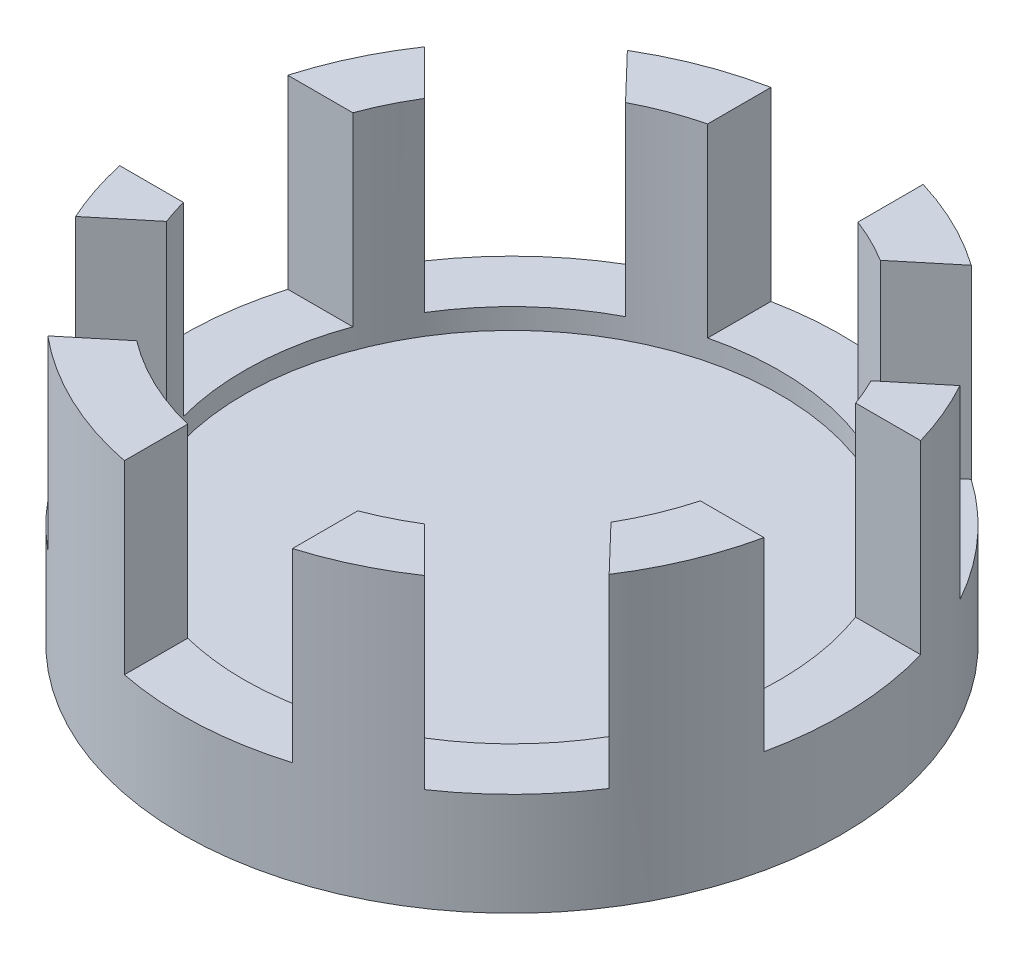
ISO-10303-21;
HEADER;
FILE_DESCRIPTION(('STEP AP214'),'2;1');
FILE_NAME('part.step','',(''),(''),'','','');
FILE_SCHEMA(('AUTOMOTIVE_DESIGN { 1 0 10303 214 1 1 1 1 }'));
ENDSEC;
DATA;
#1=APPLICATION_CONTEXT('core data for automotive mechanical design processes');
#2=APPLICATION_PROTOCOL_DEFINITION('international standard','automotive_design',2000,#1);
#3=PRODUCT_CONTEXT('',#1,'mechanical');
#4=PRODUCT('Part','Part','',(#3));
#5=PRODUCT_RELATED_PRODUCT_CATEGORY('part','',(#4));
#6=PRODUCT_DEFINITION_FORMATION('','',#4);
#7=PRODUCT_DEFINITION_CONTEXT('part definition',#1,'design');
#8=PRODUCT_DEFINITION('design','',#6,#7);
#9=PRODUCT_DEFINITION_SHAPE('','',#8);
#10=(LENGTH_UNIT() NAMED_UNIT(*) SI_UNIT(.MILLI.,.METRE.));
#11=(NAMED_UNIT(*) PLANE_ANGLE_UNIT() SI_UNIT($,.RADIAN.));
#12=(NAMED_UNIT(*) SI_UNIT($,.STERADIAN.) SOLID_ANGLE_UNIT());
#13=UNCERTAINTY_MEASURE_WITH_UNIT(LENGTH_MEASURE(1.E-05),#10,'distance_accuracy_value','');
#14=(GEOMETRIC_REPRESENTATION_CONTEXT(3) GLOBAL_UNCERTAINTY_ASSIGNED_CONTEXT((#13)) GLOBAL_UNIT_ASSIGNED_CONTEXT((#10,
#11,#12)) REPRESENTATION_CONTEXT('',''));
#15=CARTESIAN_POINT('',(0.,0.,0.));
#16=DIRECTION('',(0.,0.,1.));
#17=DIRECTION('',(1.,0.,0.));
#18=AXIS2_PLACEMENT_3D('',#15,#16,#17);
#19=CARTESIAN_POINT('',(0.,20.,0.));
#20=DIRECTION('',(0.,-1.,0.));
#21=DIRECTION('',(0.,0.,-1.));
#22=AXIS2_PLACEMENT_3D('',#19,#20,#21);
#23=CYLINDRICAL_SURFACE('',#22,16.);
#24=DIRECTION('',(0.,-1.,0.));
#25=VECTOR('',#24,1.);
#26=CARTESIAN_POINT('',(4.65163966751769,20.,-15.3088944213348));
#27=LINE('',#26,#25);
#28=CARTESIAN_POINT('',(4.65163966751769,5.,-15.3088944213348));
#29=VERTEX_POINT('',#28);
#30=CARTESIAN_POINT('',(4.65163966751769,14.,-15.3088944213348));
#31=VERTEX_POINT('',#30);
#32=EDGE_CURVE('E380',#29,#31,#27,.F.);
#33=ORIENTED_EDGE('',*,*,#32,.T.);
#34=CARTESIAN_POINT('',(0.,14.,0.));
#35=DIRECTION('',(0.,-1.,0.));
#36=DIRECTION('',(0.,0.,-1.));
#37=AXIS2_PLACEMENT_3D('',#34,#35,#36);
#38=CIRCLE('',#37,16.);
#39=CARTESIAN_POINT('',(9.21798652618479,14.,-13.0777950895048));
#40=VERTEX_POINT('',#39);
#41=EDGE_CURVE('E510',#31,#40,#38,.T.);
#42=ORIENTED_EDGE('',*,*,#41,.T.);
#43=DIRECTION('',(0.,1.,0.));
#44=VECTOR('',#43,1.);
#45=CARTESIAN_POINT('',(9.21798652618479,5.,-13.0777950895048));
#46=LINE('',#45,#44);
#47=CARTESIAN_POINT('',(9.21798652618479,5.,-13.0777950895048));
#48=VERTEX_POINT('',#47);
#49=EDGE_CURVE('E321',#48,#40,#46,.T.);
#50=ORIENTED_EDGE('',*,*,#49,.F.);
#51=CARTESIAN_POINT('',(0.,5.,0.));
#52=DIRECTION('',(0.,1.,0.));
#53=DIRECTION('',(0.,0.,1.));
#54=AXIS2_PLACEMENT_3D('',#51,#52,#53);
#55=CIRCLE('',#54,16.);
#56=CARTESIAN_POINT('',(14.0015684628841,5.,-7.74313118700506));
#57=VERTEX_POINT('',#56);
#58=EDGE_CURVE('E305',#57,#48,#55,.T.);
#59=ORIENTED_EDGE('',*,*,#58,.F.);
#60=DIRECTION('',(0.,1.,0.));
#61=VECTOR('',#60,1.);
#62=CARTESIAN_POINT('',(14.0015684628841,5.,-7.74313118700506));
#63=LINE('',#62,#61);
#64=CARTESIAN_POINT('',(14.0015684628841,14.,-7.74313118700506));
#65=VERTEX_POINT('',#64);
#66=EDGE_CURVE('E313',#57,#65,#63,.T.);
#67=ORIENTED_EDGE('',*,*,#66,.T.);
#68=CARTESIAN_POINT('',(15.3604587451895,14.,-4.47842685966077));
#69=VERTEX_POINT('',#68);
#70=EDGE_CURVE('E503',#65,#69,#38,.T.);
#71=ORIENTED_EDGE('',*,*,#70,.T.);
#72=DIRECTION('',(0.,-1.,0.));
#73=VECTOR('',#72,1.);
#74=CARTESIAN_POINT('',(15.3604587451895,20.,-4.47842685966077));
#75=LINE('',#74,#73);
#76=CARTESIAN_POINT('',(15.3604587451895,5.,-4.47842685966077));
#77=VERTEX_POINT('',#76);
#78=EDGE_CURVE('E404',#69,#77,#75,.T.);
#79=ORIENTED_EDGE('',*,*,#78,.T.);
#80=CARTESIAN_POINT('',(0.,5.,0.));
#81=DIRECTION('',(0.,-1.,0.));
#82=DIRECTION('',(0.,0.,-1.));
#83=AXIS2_PLACEMENT_3D('',#80,#81,#82);
#84=CIRCLE('',#83,16.);
#85=CARTESIAN_POINT('',(15.6341428460777,5.,3.40199610059112));
#86=VERTEX_POINT('',#85);
#87=EDGE_CURVE('E427',#77,#86,#84,.T.);
#88=ORIENTED_EDGE('',*,*,#87,.T.);
#89=DIRECTION('',(0.,-1.,0.));
#90=VECTOR('',#89,1.);
#91=CARTESIAN_POINT('',(15.6341428460777,20.,3.40199610059112));
#92=LINE('',#91,#90);
#93=CARTESIAN_POINT('',(15.6341428460777,14.,3.40199610059112));
#94=VERTEX_POINT('',#93);
#95=EDGE_CURVE('E283',#94,#86,#92,.T.);
#96=ORIENTED_EDGE('',*,*,#95,.F.);
#97=CARTESIAN_POINT('',(13.4239339734717,14.,8.70620449311135));
#98=VERTEX_POINT('',#97);
#99=EDGE_CURVE('E268',#94,#98,#38,.T.);
#100=ORIENTED_EDGE('',*,*,#99,.T.);
#101=DIRECTION('',(0.,-1.,0.));
#102=VECTOR('',#101,1.);
#103=CARTESIAN_POINT('',(13.4239339734717,20.,8.70620449311134));
#104=LINE('',#103,#102);
#105=CARTESIAN_POINT('',(13.4239339734717,5.,8.70620449311134));
#106=VERTEX_POINT('',#105);
#107=EDGE_CURVE('E281',#106,#98,#104,.F.);
#108=ORIENTED_EDGE('',*,*,#107,.F.);
#109=CARTESIAN_POINT('',(0.,5.,0.));
#110=DIRECTION('',(0.,1.,0.));
#111=DIRECTION('',(0.,0.,1.));
#112=AXIS2_PLACEMENT_3D('',#109,#110,#111);
#113=CIRCLE('',#112,16.);
#114=CARTESIAN_POINT('',(8.98940685394295,5.,13.2359572534171));
#115=VERTEX_POINT('',#114);
#116=EDGE_CURVE('E301',#115,#106,#113,.T.);
#117=ORIENTED_EDGE('',*,*,#116,.F.);
#118=DIRECTION('',(0.,-1.,0.));
#119=VECTOR('',#118,1.);
#120=CARTESIAN_POINT('',(8.98940685394295,20.,13.2359572534171));
#121=LINE('',#120,#119);
#122=CARTESIAN_POINT('',(8.98940685394295,14.,13.2359572534171));
#123=VERTEX_POINT('',#122);
#124=EDGE_CURVE('E294',#115,#123,#121,.F.);
#125=ORIENTED_EDGE('',*,*,#124,.T.);
#126=CARTESIAN_POINT('',(4.65163966751769,14.,15.3088944213348));
#127=VERTEX_POINT('',#126);
#128=EDGE_CURVE('E286',#123,#127,#38,.T.);
#129=ORIENTED_EDGE('',*,*,#128,.T.);
#130=DIRECTION('',(0.,-1.,0.));
#131=VECTOR('',#130,1.);
#132=CARTESIAN_POINT('',(4.65163966751769,20.,15.3088944213348));
#133=LINE('',#132,#131);
#134=CARTESIAN_POINT('',(4.65163966751769,5.,15.3088944213348));
#135=VERTEX_POINT('',#134);
#136=EDGE_CURVE('E382',#127,#135,#133,.T.);
#137=ORIENTED_EDGE('',*,*,#136,.T.);
#138=CARTESIAN_POINT('',(0.,5.,0.));
#139=DIRECTION('',(0.,-1.,0.));
#140=DIRECTION('',(0.,0.,-1.));
#141=AXIS2_PLACEMENT_3D('',#138,#139,#140);
#142=CIRCLE('',#141,16.);
#143=CARTESIAN_POINT('',(-3.12181870547557,5.,15.6924901774748));
#144=VERTEX_POINT('',#143);
#145=EDGE_CURVE('E387',#135,#144,#142,.T.);
#146=ORIENTED_EDGE('',*,*,#145,.T.);
#147=DIRECTION('',(0.,-1.,0.));
#148=VECTOR('',#147,1.);
#149=CARTESIAN_POINT('',(-3.12181870547557,20.,15.6924901774748));
#150=LINE('',#149,#148);
#151=CARTESIAN_POINT('',(-3.12181870547557,14.,15.6924901774748));
#152=VERTEX_POINT('',#151);
#153=EDGE_CURVE('E370',#144,#152,#150,.F.);
#154=ORIENTED_EDGE('',*,*,#153,.T.);
#155=CARTESIAN_POINT('',(-10.2261948236587,14.,12.3054841200408));
#156=VERTEX_POINT('',#155);
#157=EDGE_CURVE('E482',#152,#156,#38,.T.);
#158=ORIENTED_EDGE('',*,*,#157,.T.);
#159=DIRECTION('',(0.,-1.,0.));
#160=VECTOR('',#159,1.);
#161=CARTESIAN_POINT('',(-10.2261948236587,20.,12.3054841200408));
#162=LINE('',#161,#160);
#163=CARTESIAN_POINT('',(-10.2261948236587,5.,12.3054841200408));
#164=VERTEX_POINT('',#163);
#165=EDGE_CURVE('E352',#164,#156,#162,.F.);
#166=ORIENTED_EDGE('',*,*,#165,.F.);
#167=CARTESIAN_POINT('',(0.,5.,0.));
#168=DIRECTION('',(0.,1.,0.));
#169=DIRECTION('',(0.,0.,1.));
#170=AXIS2_PLACEMENT_3D('',#167,#168,#169);
#171=CIRCLE('',#170,16.);
#172=CARTESIAN_POINT('',(-14.5715954429554,5.,6.60822262388625));
#173=VERTEX_POINT('',#172);
#174=EDGE_CURVE('E350',#173,#164,#171,.T.);
#175=ORIENTED_EDGE('',*,*,#174,.F.);
#176=DIRECTION('',(0.,-1.,0.));
#177=VECTOR('',#176,1.);
#178=CARTESIAN_POINT('',(-14.5715954429554,20.,6.60822262388625));
#179=LINE('',#178,#177);
#180=CARTESIAN_POINT('',(-14.5715954429554,14.,6.60822262388625));
#181=VERTEX_POINT('',#180);
#182=EDGE_CURVE('E355',#181,#173,#179,.T.);
#183=ORIENTED_EDGE('',*,*,#182,.F.);
#184=CARTESIAN_POINT('',(-15.6341428460777,14.,3.40199610059112));
#185=VERTEX_POINT('',#184);
#186=EDGE_CURVE('E74',#181,#185,#38,.T.);
#187=ORIENTED_EDGE('',*,*,#186,.T.);
#188=DIRECTION('',(0.,-1.,0.));
#189=VECTOR('',#188,1.);
#190=CARTESIAN_POINT('',(-15.6341428460777,20.,3.40199610059112));
#191=LINE('',#190,#189);
#192=CARTESIAN_POINT('',(-15.6341428460777,5.,3.40199610059112));
#193=VERTEX_POINT('',#192);
#194=EDGE_CURVE('E420',#193,#185,#191,.F.);
#195=ORIENTED_EDGE('',*,*,#194,.F.);
#196=CARTESIAN_POINT('',(-15.3604587451895,5.,-4.47842685966077));
#197=VERTEX_POINT('',#196);
#198=EDGE_CURVE('E424',#193,#197,#84,.T.);
#199=ORIENTED_EDGE('',*,*,#198,.T.);
#200=DIRECTION('',(0.,-1.,0.));
#201=VECTOR('',#200,1.);
#202=CARTESIAN_POINT('',(-15.3604587451895,20.,-4.47842685966077));
#203=LINE('',#202,#201);
#204=CARTESIAN_POINT('',(-15.3604587451895,14.,-4.47842685966077));
#205=VERTEX_POINT('',#204);
#206=EDGE_CURVE('E398',#197,#205,#203,.F.);
#207=ORIENTED_EDGE('',*,*,#206,.T.);
#208=CARTESIAN_POINT('',(-13.2359572534171,14.,-8.98940685394295));
#209=VERTEX_POINT('',#208);
#210=EDGE_CURVE('E495',#205,#209,#38,.T.);
#211=ORIENTED_EDGE('',*,*,#210,.T.);
#212=DIRECTION('',(0.,-1.,0.));
#213=VECTOR('',#212,1.);
#214=CARTESIAN_POINT('',(-13.2359572534171,20.,-8.98940685394295));
#215=LINE('',#214,#213);
#216=CARTESIAN_POINT('',(-13.2359572534171,5.,-8.98940685394295));
#217=VERTEX_POINT('',#216);
#218=EDGE_CURVE('E334',#209,#217,#215,.T.);
#219=ORIENTED_EDGE('',*,*,#218,.T.);
#220=CARTESIAN_POINT('',(0.,5.,0.));
#221=DIRECTION('',(0.,1.,0.));
#222=DIRECTION('',(0.,0.,1.));
#223=AXIS2_PLACEMENT_3D('',#220,#221,#222);
#224=CIRCLE('',#223,16.);
#225=CARTESIAN_POINT('',(-8.1611205847714,5.,-13.7621259549831));
#226=VERTEX_POINT('',#225);
#227=EDGE_CURVE('E341',#226,#217,#224,.T.);
#228=ORIENTED_EDGE('',*,*,#227,.F.);
#229=DIRECTION('',(0.,-1.,0.));
#230=VECTOR('',#229,1.);
#231=CARTESIAN_POINT('',(-8.1611205847714,20.,-13.7621259549831));
#232=LINE('',#231,#230);
#233=CARTESIAN_POINT('',(-8.1611205847714,14.,-13.7621259549831));
#234=VERTEX_POINT('',#233);
#235=EDGE_CURVE('E339',#234,#226,#232,.T.);
#236=ORIENTED_EDGE('',*,*,#235,.F.);
#237=CARTESIAN_POINT('',(-3.12181870547557,14.,-15.6924901774748));
#238=VERTEX_POINT('',#237);
#239=EDGE_CURVE('E488',#234,#238,#38,.T.);
#240=ORIENTED_EDGE('',*,*,#239,.T.);
#241=DIRECTION('',(0.,-1.,0.));
#242=VECTOR('',#241,1.);
#243=CARTESIAN_POINT('',(-3.12181870547557,20.,-15.6924901774748));
#244=LINE('',#243,#242);
#245=CARTESIAN_POINT('',(-3.12181870547557,5.,-15.6924901774748));
#246=VERTEX_POINT('',#245);
#247=EDGE_CURVE('E373',#238,#246,#244,.T.);
#248=ORIENTED_EDGE('',*,*,#247,.T.);
#249=EDGE_CURVE('E384',#246,#29,#142,.T.);
#250=ORIENTED_EDGE('',*,*,#249,.T.);
#251=EDGE_LOOP('',(#33,#42,#50,#59,#67,#71,#79,#88,#96,#100,#108,#117,#125,#129,#137,#146,#154,
#158,#166,#175,#183,#187,#195,#199,#207,#211,#219,#228,#236,#240,#248,#250));
#252=FACE_BOUND('',#251,.T.);
#253=CARTESIAN_POINT('',(0.,0.,0.));
#254=DIRECTION('',(0.,1.,0.));
#255=DIRECTION('',(0.,0.,1.));
#256=AXIS2_PLACEMENT_3D('',#253,#254,#255);
#257=CIRCLE('',#256,16.);
#258=CARTESIAN_POINT('',(0.,0.,16.));
#259=VERTEX_POINT('',#258);
#260=EDGE_CURVE('E431',#259,#259,#257,.T.);
#261=ORIENTED_EDGE('',*,*,#260,.T.);
#262=EDGE_LOOP('',(#261));
#263=FACE_BOUND('',#262,.T.);
#264=ADVANCED_FACE('F60',(#252,#263),#23,.T.);
#265=CARTESIAN_POINT('',(0.,4.,0.));
#266=DIRECTION('',(0.,1.,0.));
#267=DIRECTION('',(0.,0.,1.));
#268=AXIS2_PLACEMENT_3D('',#265,#266,#267);
#269=CYLINDRICAL_SURFACE('',#268,13.);
#270=CARTESIAN_POINT('',(0.,4.,0.));
#271=DIRECTION('',(0.,1.,0.));
#272=DIRECTION('',(0.,0.,1.));
#273=AXIS2_PLACEMENT_3D('',#270,#271,#272);
#274=CIRCLE('',#273,13.);
#275=CARTESIAN_POINT('',(0.,4.,13.));
#276=VERTEX_POINT('',#275);
#277=EDGE_CURVE('E428',#276,#276,#274,.T.);
#278=ORIENTED_EDGE('',*,*,#277,.F.);
#279=EDGE_LOOP('',(#278));
#280=FACE_BOUND('',#279,.T.);
#281=DIRECTION('',(0.,1.,0.));
#282=VECTOR('',#281,1.);
#283=CARTESIAN_POINT('',(-3.12181870547557,4.,-12.6195977737067));
#284=LINE('',#283,#282);
#285=CARTESIAN_POINT('',(-3.12181870547557,5.,-12.6195977737067));
#286=VERTEX_POINT('',#285);
#287=CARTESIAN_POINT('',(-3.12181870547557,14.,-12.6195977737067));
#288=VERTEX_POINT('',#287);
#289=EDGE_CURVE('E365',#286,#288,#284,.T.);
#290=ORIENTED_EDGE('',*,*,#289,.T.);
#291=CARTESIAN_POINT('',(0.,14.,0.));
#292=DIRECTION('',(0.,-1.,0.));
#293=DIRECTION('',(0.,0.,-1.));
#294=AXIS2_PLACEMENT_3D('',#291,#292,#293);
#295=CIRCLE('',#294,13.);
#296=CARTESIAN_POINT('',(-6.01279974744786,14.,-11.5258942905569));
#297=VERTEX_POINT('',#296);
#298=EDGE_CURVE('E491',#288,#297,#295,.F.);
#299=ORIENTED_EDGE('',*,*,#298,.T.);
#300=DIRECTION('',(0.,1.,0.));
#301=VECTOR('',#300,1.);
#302=CARTESIAN_POINT('',(-6.01279974744786,4.,-11.5258942905569));
#303=LINE('',#302,#301);
#304=CARTESIAN_POINT('',(-6.01279974744786,5.,-11.5258942905569));
#305=VERTEX_POINT('',#304);
#306=EDGE_CURVE('E336',#305,#297,#303,.T.);
#307=ORIENTED_EDGE('',*,*,#306,.F.);
#308=CARTESIAN_POINT('',(0.,5.,0.));
#309=DIRECTION('',(0.,1.,0.));
#310=DIRECTION('',(0.,0.,1.));
#311=AXIS2_PLACEMENT_3D('',#308,#309,#310);
#312=CIRCLE('',#311,13.);
#313=CARTESIAN_POINT('',(-11.0670832492304,5.,-6.82053284975627));
#314=VERTEX_POINT('',#313);
#315=EDGE_CURVE('E459',#314,#305,#312,.F.);
#316=ORIENTED_EDGE('',*,*,#315,.F.);
#317=DIRECTION('',(0.,1.,0.));
#318=VECTOR('',#317,1.);
#319=CARTESIAN_POINT('',(-11.0670832492304,4.,-6.82053284975627));
#320=LINE('',#319,#318);
#321=CARTESIAN_POINT('',(-11.0670832492304,14.,-6.82053284975627));
#322=VERTEX_POINT('',#321);
#323=EDGE_CURVE('E329',#314,#322,#320,.T.);
#324=ORIENTED_EDGE('',*,*,#323,.T.);
#325=CARTESIAN_POINT('',(-12.2042489675797,14.,-4.47842685966077));
#326=VERTEX_POINT('',#325);
#327=EDGE_CURVE('E499',#322,#326,#295,.F.);
#328=ORIENTED_EDGE('',*,*,#327,.T.);
#329=DIRECTION('',(0.,1.,0.));
#330=VECTOR('',#329,1.);
#331=CARTESIAN_POINT('',(-12.2042489675797,4.,-4.47842685966077));
#332=LINE('',#331,#330);
#333=CARTESIAN_POINT('',(-12.2042489675797,5.,-4.47842685966077));
#334=VERTEX_POINT('',#333);
#335=EDGE_CURVE('E444',#326,#334,#332,.F.);
#336=ORIENTED_EDGE('',*,*,#335,.T.);
#337=CARTESIAN_POINT('',(0.,5.,0.));
#338=DIRECTION('',(0.,-1.,0.));
#339=DIRECTION('',(0.,0.,-1.));
#340=AXIS2_PLACEMENT_3D('',#337,#338,#339);
#341=CIRCLE('',#340,13.);
#342=CARTESIAN_POINT('',(-12.5469686590651,5.,3.40199610059112));
#343=VERTEX_POINT('',#342);
#344=EDGE_CURVE('E441',#334,#343,#341,.F.);
#345=ORIENTED_EDGE('',*,*,#344,.T.);
#346=DIRECTION('',(0.,1.,0.));
#347=VECTOR('',#346,1.);
#348=CARTESIAN_POINT('',(-12.5469686590651,4.,3.40199610059112));
#349=LINE('',#348,#347);
#350=CARTESIAN_POINT('',(-12.5469686590651,14.,3.40199610059112));
#351=VERTEX_POINT('',#350);
#352=EDGE_CURVE('E446',#351,#343,#349,.F.);
#353=ORIENTED_EDGE('',*,*,#352,.F.);
#354=CARTESIAN_POINT('',(-12.1555612647663,14.,4.6089402619815));
#355=VERTEX_POINT('',#354);
#356=EDGE_CURVE('E478',#351,#355,#295,.F.);
#357=ORIENTED_EDGE('',*,*,#356,.T.);
#358=DIRECTION('',(0.,1.,0.));
#359=VECTOR('',#358,1.);
#360=CARTESIAN_POINT('',(-12.1555612647663,4.,4.6089402619815));
#361=LINE('',#360,#359);
#362=CARTESIAN_POINT('',(-12.1555612647663,5.,4.6089402619815));
#363=VERTEX_POINT('',#362);
#364=EDGE_CURVE('E456',#363,#355,#361,.T.);
#365=ORIENTED_EDGE('',*,*,#364,.F.);
#366=CARTESIAN_POINT('',(0.,5.,0.));
#367=DIRECTION('',(0.,1.,0.));
#368=DIRECTION('',(0.,0.,1.));
#369=AXIS2_PLACEMENT_3D('',#366,#367,#368);
#370=CIRCLE('',#369,13.);
#371=CARTESIAN_POINT('',(-7.86459017066455,5.,10.3512425074233));
#372=VERTEX_POINT('',#371);
#373=EDGE_CURVE('E452',#372,#363,#370,.F.);
#374=ORIENTED_EDGE('',*,*,#373,.F.);
#375=DIRECTION('',(0.,1.,0.));
#376=VECTOR('',#375,1.);
#377=CARTESIAN_POINT('',(-7.86459017066455,4.,10.3512425074233));
#378=LINE('',#377,#376);
#379=CARTESIAN_POINT('',(-7.86459017066455,14.,10.3512425074233));
#380=VERTEX_POINT('',#379);
#381=EDGE_CURVE('E454',#380,#372,#378,.F.);
#382=ORIENTED_EDGE('',*,*,#381,.F.);
#383=CARTESIAN_POINT('',(-3.12181870547557,14.,12.6195977737067));
#384=VERTEX_POINT('',#383);
#385=EDGE_CURVE('E82',#380,#384,#295,.F.);
#386=ORIENTED_EDGE('',*,*,#385,.T.);
#387=DIRECTION('',(0.,1.,0.));
#388=VECTOR('',#387,1.);
#389=CARTESIAN_POINT('',(-3.12181870547557,4.,12.6195977737067));
#390=LINE('',#389,#388);
#391=CARTESIAN_POINT('',(-3.12181870547557,5.,12.6195977737067));
#392=VERTEX_POINT('',#391);
#393=EDGE_CURVE('E368',#384,#392,#390,.F.);
#394=ORIENTED_EDGE('',*,*,#393,.T.);
#395=CARTESIAN_POINT('',(0.,5.,0.));
#396=DIRECTION('',(0.,-1.,0.));
#397=DIRECTION('',(0.,0.,-1.));
#398=AXIS2_PLACEMENT_3D('',#395,#396,#397);
#399=CIRCLE('',#398,13.);
#400=CARTESIAN_POINT('',(4.65163966751769,5.,12.1392853333125));
#401=VERTEX_POINT('',#400);
#402=EDGE_CURVE('E451',#392,#401,#399,.F.);
#403=ORIENTED_EDGE('',*,*,#402,.T.);
#404=DIRECTION('',(0.,1.,0.));
#405=VECTOR('',#404,1.);
#406=CARTESIAN_POINT('',(4.65163966751769,4.,12.1392853333125));
#407=LINE('',#406,#405);
#408=CARTESIAN_POINT('',(4.65163966751769,14.,12.1392853333125));
#409=VERTEX_POINT('',#408);
#410=EDGE_CURVE('E375',#401,#409,#407,.T.);
#411=ORIENTED_EDGE('',*,*,#410,.T.);
#412=CARTESIAN_POINT('',(6.82053284975627,14.,11.0670832492304));
#413=VERTEX_POINT('',#412);
#414=EDGE_CURVE('E519',#409,#413,#295,.F.);
#415=ORIENTED_EDGE('',*,*,#414,.T.);
#416=DIRECTION('',(0.,1.,0.));
#417=VECTOR('',#416,1.);
#418=CARTESIAN_POINT('',(6.82053284975627,4.,11.0670832492304));
#419=LINE('',#418,#417);
#420=CARTESIAN_POINT('',(6.82053284975627,5.,11.0670832492304));
#421=VERTEX_POINT('',#420);
#422=EDGE_CURVE('E291',#413,#421,#419,.F.);
#423=ORIENTED_EDGE('',*,*,#422,.T.);
#424=CARTESIAN_POINT('',(0.,5.,0.));
#425=DIRECTION('',(0.,1.,0.));
#426=DIRECTION('',(0.,0.,1.));
#427=AXIS2_PLACEMENT_3D('',#424,#425,#426);
#428=CIRCLE('',#427,13.);
#429=CARTESIAN_POINT('',(11.2756131361482,5.,6.46997282868505));
#430=VERTEX_POINT('',#429);
#431=EDGE_CURVE('E67',#430,#421,#428,.F.);
#432=ORIENTED_EDGE('',*,*,#431,.F.);
#433=DIRECTION('',(0.,1.,0.));
#434=VECTOR('',#433,1.);
#435=CARTESIAN_POINT('',(11.2756131361482,4.,6.46997282868505));
#436=LINE('',#435,#434);
#437=CARTESIAN_POINT('',(11.2756131361482,14.,6.46997282868505));
#438=VERTEX_POINT('',#437);
#439=EDGE_CURVE('E292',#438,#430,#436,.F.);
#440=ORIENTED_EDGE('',*,*,#439,.F.);
#441=CARTESIAN_POINT('',(12.5469686590651,14.,3.40199610059112));
#442=VERTEX_POINT('',#441);
#443=EDGE_CURVE('E271',#438,#442,#295,.F.);
#444=ORIENTED_EDGE('',*,*,#443,.T.);
#445=DIRECTION('',(0.,1.,0.));
#446=VECTOR('',#445,1.);
#447=CARTESIAN_POINT('',(12.5469686590651,4.,3.40199610059112));
#448=LINE('',#447,#446);
#449=CARTESIAN_POINT('',(12.5469686590651,5.,3.40199610059112));
#450=VERTEX_POINT('',#449);
#451=EDGE_CURVE('E440',#450,#442,#448,.T.);
#452=ORIENTED_EDGE('',*,*,#451,.F.);
#453=CARTESIAN_POINT('',(12.2042489675796,5.,-4.47842685966077));
#454=VERTEX_POINT('',#453);
#455=EDGE_CURVE('E437',#450,#454,#341,.F.);
#456=ORIENTED_EDGE('',*,*,#455,.T.);
#457=DIRECTION('',(0.,1.,0.));
#458=VECTOR('',#457,1.);
#459=CARTESIAN_POINT('',(12.2042489675797,4.,-4.47842685966077));
#460=LINE('',#459,#458);
#461=CARTESIAN_POINT('',(12.2042489675797,14.,-4.47842685966077));
#462=VERTEX_POINT('',#461);
#463=EDGE_CURVE('E434',#454,#462,#460,.T.);
#464=ORIENTED_EDGE('',*,*,#463,.T.);
#465=CARTESIAN_POINT('',(11.6399638098899,14.,-5.78888957438754));
#466=VERTEX_POINT('',#465);
#467=EDGE_CURVE('E506',#462,#466,#295,.F.);
#468=ORIENTED_EDGE('',*,*,#467,.T.);
#469=DIRECTION('',(0.,1.,0.));
#470=VECTOR('',#469,1.);
#471=CARTESIAN_POINT('',(11.6399638098899,5.,-5.78888957438754));
#472=LINE('',#471,#470);
#473=CARTESIAN_POINT('',(11.6399638098899,5.,-5.78888957438754));
#474=VERTEX_POINT('',#473);
#475=EDGE_CURVE('E314',#474,#466,#472,.T.);
#476=ORIENTED_EDGE('',*,*,#475,.F.);
#477=CARTESIAN_POINT('',(0.,5.,0.));
#478=DIRECTION('',(0.,1.,0.));
#479=DIRECTION('',(0.,0.,1.));
#480=AXIS2_PLACEMENT_3D('',#477,#478,#479);
#481=CIRCLE('',#480,13.);
#482=CARTESIAN_POINT('',(6.80195234799567,5.,-11.0785127276));
#483=VERTEX_POINT('',#482);
#484=EDGE_CURVE('E310',#483,#474,#481,.F.);
#485=ORIENTED_EDGE('',*,*,#484,.F.);
#486=DIRECTION('',(0.,1.,0.));
#487=VECTOR('',#486,1.);
#488=CARTESIAN_POINT('',(6.80195234799567,5.,-11.0785127276));
#489=LINE('',#488,#487);
#490=CARTESIAN_POINT('',(6.80195234799567,14.,-11.0785127276));
#491=VERTEX_POINT('',#490);
#492=EDGE_CURVE('E318',#483,#491,#489,.T.);
#493=ORIENTED_EDGE('',*,*,#492,.T.);
#494=CARTESIAN_POINT('',(4.65163966751769,14.,-12.1392853333125));
#495=VERTEX_POINT('',#494);
#496=EDGE_CURVE('E513',#491,#495,#295,.F.);
#497=ORIENTED_EDGE('',*,*,#496,.T.);
#498=DIRECTION('',(0.,1.,0.));
#499=VECTOR('',#498,1.);
#500=CARTESIAN_POINT('',(4.65163966751769,4.,-12.1392853333125));
#501=LINE('',#500,#499);
#502=CARTESIAN_POINT('',(4.65163966751769,5.,-12.1392853333125));
#503=VERTEX_POINT('',#502);
#504=EDGE_CURVE('E378',#495,#503,#501,.F.);
#505=ORIENTED_EDGE('',*,*,#504,.T.);
#506=EDGE_CURVE('E448',#503,#286,#399,.F.);
#507=ORIENTED_EDGE('',*,*,#506,.T.);
#508=EDGE_LOOP('',(#290,#299,#307,#316,#324,#328,#336,#345,#353,#357,#365,#374,#382,#386,#394,
#403,#411,#415,#423,#432,#440,#444,#452,#456,#464,#468,#476,#485,#493,#497,#505,#507));
#509=FACE_BOUND('',#508,.T.);
#510=ADVANCED_FACE('F547',(#280,#509),#269,.F.);
#511=CARTESIAN_POINT('',(0.,0.,0.));
#512=DIRECTION('',(0.,1.,0.));
#513=DIRECTION('',(0.,0.,1.));
#514=AXIS2_PLACEMENT_3D('',#511,#512,#513);
#515=PLANE('',#514);
#516=ORIENTED_EDGE('',*,*,#260,.F.);
#517=EDGE_LOOP('',(#516));
#518=FACE_BOUND('',#517,.T.);
#519=ADVANCED_FACE('F610',(#518),#515,.F.);
#520=CARTESIAN_POINT('',(0.,4.,0.));
#521=DIRECTION('',(0.,1.,0.));
#522=DIRECTION('',(0.,0.,1.));
#523=AXIS2_PLACEMENT_3D('',#520,#521,#522);
#524=PLANE('',#523);
#525=ORIENTED_EDGE('',*,*,#277,.T.);
#526=EDGE_LOOP('',(#525));
#527=FACE_BOUND('',#526,.T.);
#528=ADVANCED_FACE('F603',(#527),#524,.T.);
#529=CARTESIAN_POINT('',(-21.1155250121687,20.,3.40199610059112));
#530=DIRECTION('',(0.,0.,-1.));
#531=DIRECTION('',(-1.,0.,0.));
#532=AXIS2_PLACEMENT_3D('',#529,#530,#531);
#533=PLANE('',#532);
#534=DIRECTION('',(-1.,0.,0.));
#535=VECTOR('',#534,1.);
#536=CARTESIAN_POINT('',(-21.1155250121687,14.,3.40199610059112));
#537=LINE('',#536,#535);
#538=EDGE_CURVE('E284',#94,#442,#537,.T.);
#539=ORIENTED_EDGE('',*,*,#538,.F.);
#540=ORIENTED_EDGE('',*,*,#95,.T.);
#541=DIRECTION('',(1.,0.,0.));
#542=VECTOR('',#541,1.);
#543=CARTESIAN_POINT('',(-21.1155250121687,5.,3.40199610059112));
#544=LINE('',#543,#542);
#545=EDGE_CURVE('E411',#450,#86,#544,.T.);
#546=ORIENTED_EDGE('',*,*,#545,.F.);
#547=ORIENTED_EDGE('',*,*,#451,.T.);
#548=EDGE_LOOP('',(#539,#540,#546,#547));
#549=FACE_BOUND('',#548,.T.);
#550=ADVANCED_FACE('F601',(#549),#533,.T.);
#551=CARTESIAN_POINT('',(-21.1155250121687,20.,-4.47842685966077));
#552=DIRECTION('',(0.,0.,-1.));
#553=DIRECTION('',(-1.,0.,0.));
#554=AXIS2_PLACEMENT_3D('',#551,#552,#553);
#555=PLANE('',#554);
#556=ORIENTED_EDGE('',*,*,#78,.F.);
#557=DIRECTION('',(-1.,0.,0.));
#558=VECTOR('',#557,1.);
#559=CARTESIAN_POINT('',(-21.1155250121687,14.,-4.47842685966077));
#560=LINE('',#559,#558);
#561=EDGE_CURVE('E500',#69,#462,#560,.T.);
#562=ORIENTED_EDGE('',*,*,#561,.T.);
#563=ORIENTED_EDGE('',*,*,#463,.F.);
#564=DIRECTION('',(1.,0.,0.));
#565=VECTOR('',#564,1.);
#566=CARTESIAN_POINT('',(-21.1155250121687,5.,-4.47842685966077));
#567=LINE('',#566,#565);
#568=EDGE_CURVE('E394',#454,#77,#567,.T.);
#569=ORIENTED_EDGE('',*,*,#568,.T.);
#570=EDGE_LOOP('',(#556,#562,#563,#569));
#571=FACE_BOUND('',#570,.T.);
#572=ADVANCED_FACE('F595',(#571),#555,.F.);
#573=CARTESIAN_POINT('',(0.,5.,0.));
#574=DIRECTION('',(0.,-1.,0.));
#575=DIRECTION('',(0.,0.,-1.));
#576=AXIS2_PLACEMENT_3D('',#573,#574,#575);
#577=PLANE('',#576);
#578=ORIENTED_EDGE('',*,*,#568,.F.);
#579=ORIENTED_EDGE('',*,*,#455,.F.);
#580=ORIENTED_EDGE('',*,*,#545,.T.);
#581=ORIENTED_EDGE('',*,*,#87,.F.);
#582=EDGE_LOOP('',(#578,#579,#580,#581));
#583=FACE_BOUND('',#582,.T.);
#584=ADVANCED_FACE('F598',(#583),#577,.F.);
#585=EDGE_CURVE('E406',#193,#343,#544,.T.);
#586=ORIENTED_EDGE('',*,*,#585,.T.);
#587=ORIENTED_EDGE('',*,*,#344,.F.);
#588=EDGE_CURVE('E396',#197,#334,#567,.T.);
#589=ORIENTED_EDGE('',*,*,#588,.F.);
#590=ORIENTED_EDGE('',*,*,#198,.F.);
#591=EDGE_LOOP('',(#586,#587,#589,#590));
#592=FACE_BOUND('',#591,.T.);
#593=ADVANCED_FACE('F549',(#592),#577,.F.);
#594=DIRECTION('',(-1.,0.,0.));
#595=VECTOR('',#594,1.);
#596=CARTESIAN_POINT('',(-21.1155250121687,14.,3.40199610059112));
#597=LINE('',#596,#595);
#598=EDGE_CURVE('E472',#351,#185,#597,.T.);
#599=ORIENTED_EDGE('',*,*,#598,.F.);
#600=ORIENTED_EDGE('',*,*,#352,.T.);
#601=ORIENTED_EDGE('',*,*,#585,.F.);
#602=ORIENTED_EDGE('',*,*,#194,.T.);
#603=EDGE_LOOP('',(#599,#600,#601,#602));
#604=FACE_BOUND('',#603,.T.);
#605=ADVANCED_FACE('F545',(#604),#533,.T.);
#606=ORIENTED_EDGE('',*,*,#335,.F.);
#607=DIRECTION('',(-1.,0.,0.));
#608=VECTOR('',#607,1.);
#609=CARTESIAN_POINT('',(-21.1155250121687,14.,-4.47842685966077));
#610=LINE('',#609,#608);
#611=EDGE_CURVE('E492',#326,#205,#610,.T.);
#612=ORIENTED_EDGE('',*,*,#611,.T.);
#613=ORIENTED_EDGE('',*,*,#206,.F.);
#614=ORIENTED_EDGE('',*,*,#588,.T.);
#615=EDGE_LOOP('',(#606,#612,#613,#614));
#616=FACE_BOUND('',#615,.T.);
#617=ADVANCED_FACE('F551',(#616),#555,.F.);
#618=CARTESIAN_POINT('',(4.65163966751769,5.,-21.8941331093507));
#619=DIRECTION('',(1.,0.,0.));
#620=DIRECTION('',(0.,0.,-1.));
#621=AXIS2_PLACEMENT_3D('',#618,#619,#620);
#622=PLANE('',#621);
#623=ORIENTED_EDGE('',*,*,#504,.F.);
#624=DIRECTION('',(0.,0.,-1.));
#625=VECTOR('',#624,1.);
#626=CARTESIAN_POINT('',(4.65163966751769,14.,-21.8941331093507));
#627=LINE('',#626,#625);
#628=EDGE_CURVE('E507',#495,#31,#627,.T.);
#629=ORIENTED_EDGE('',*,*,#628,.T.);
#630=ORIENTED_EDGE('',*,*,#32,.F.);
#631=DIRECTION('',(0.,0.,-1.));
#632=VECTOR('',#631,1.);
#633=CARTESIAN_POINT('',(4.65163966751769,5.,-21.8941331093507));
#634=LINE('',#633,#632);
#635=EDGE_CURVE('E357',#503,#29,#634,.T.);
#636=ORIENTED_EDGE('',*,*,#635,.F.);
#637=EDGE_LOOP('',(#623,#629,#630,#636));
#638=FACE_BOUND('',#637,.T.);
#639=ADVANCED_FACE('F578',(#638),#622,.F.);
#640=CARTESIAN_POINT('',(-3.12181870547557,5.,-21.8941331093507));
#641=DIRECTION('',(-1.,0.,0.));
#642=DIRECTION('',(0.,0.,1.));
#643=AXIS2_PLACEMENT_3D('',#640,#641,#642);
#644=PLANE('',#643);
#645=ORIENTED_EDGE('',*,*,#247,.F.);
#646=DIRECTION('',(0.,0.,1.));
#647=VECTOR('',#646,1.);
#648=CARTESIAN_POINT('',(-3.12181870547557,14.,-21.8941331093507));
#649=LINE('',#648,#647);
#650=EDGE_CURVE('E485',#238,#288,#649,.T.);
#651=ORIENTED_EDGE('',*,*,#650,.T.);
#652=ORIENTED_EDGE('',*,*,#289,.F.);
#653=DIRECTION('',(0.,0.,1.));
#654=VECTOR('',#653,1.);
#655=CARTESIAN_POINT('',(-3.12181870547557,5.,-21.8941331093507));
#656=LINE('',#655,#654);
#657=EDGE_CURVE('E364',#246,#286,#656,.T.);
#658=ORIENTED_EDGE('',*,*,#657,.F.);
#659=EDGE_LOOP('',(#645,#651,#652,#658));
#660=FACE_BOUND('',#659,.T.);
#661=ADVANCED_FACE('F571',(#660),#644,.F.);
#662=CARTESIAN_POINT('',(0.,5.,0.));
#663=DIRECTION('',(0.,-1.,0.));
#664=DIRECTION('',(0.,0.,-1.));
#665=AXIS2_PLACEMENT_3D('',#662,#663,#664);
#666=PLANE('',#665);
#667=ORIENTED_EDGE('',*,*,#657,.T.);
#668=ORIENTED_EDGE('',*,*,#506,.F.);
#669=ORIENTED_EDGE('',*,*,#635,.T.);
#670=ORIENTED_EDGE('',*,*,#249,.F.);
#671=EDGE_LOOP('',(#667,#668,#669,#670));
#672=FACE_BOUND('',#671,.T.);
#673=ADVANCED_FACE('F575',(#672),#666,.F.);
#674=EDGE_CURVE('E360',#135,#401,#634,.T.);
#675=ORIENTED_EDGE('',*,*,#674,.T.);
#676=ORIENTED_EDGE('',*,*,#402,.F.);
#677=EDGE_CURVE('E361',#392,#144,#656,.T.);
#678=ORIENTED_EDGE('',*,*,#677,.T.);
#679=ORIENTED_EDGE('',*,*,#145,.F.);
#680=EDGE_LOOP('',(#675,#676,#678,#679));
#681=FACE_BOUND('',#680,.T.);
#682=ADVANCED_FACE('F663',(#681),#666,.F.);
#683=ORIENTED_EDGE('',*,*,#136,.F.);
#684=DIRECTION('',(0.,0.,-1.));
#685=VECTOR('',#684,1.);
#686=CARTESIAN_POINT('',(4.65163966751769,14.,-21.8941331093507));
#687=LINE('',#686,#685);
#688=EDGE_CURVE('E514',#127,#409,#687,.T.);
#689=ORIENTED_EDGE('',*,*,#688,.T.);
#690=ORIENTED_EDGE('',*,*,#410,.F.);
#691=ORIENTED_EDGE('',*,*,#674,.F.);
#692=EDGE_LOOP('',(#683,#689,#690,#691));
#693=FACE_BOUND('',#692,.T.);
#694=ADVANCED_FACE('F650',(#693),#622,.F.);
#695=ORIENTED_EDGE('',*,*,#393,.F.);
#696=DIRECTION('',(0.,0.,1.));
#697=VECTOR('',#696,1.);
#698=CARTESIAN_POINT('',(-3.12181870547557,14.,-21.8941331093507));
#699=LINE('',#698,#697);
#700=EDGE_CURVE('E479',#384,#152,#699,.T.);
#701=ORIENTED_EDGE('',*,*,#700,.T.);
#702=ORIENTED_EDGE('',*,*,#153,.F.);
#703=ORIENTED_EDGE('',*,*,#677,.F.);
#704=EDGE_LOOP('',(#695,#701,#702,#703));
#705=FACE_BOUND('',#704,.T.);
#706=ADVANCED_FACE('F657',(#705),#644,.F.);
#707=CARTESIAN_POINT('',(-2.6768044583853,5.,-3.23478623280927));
#708=DIRECTION('',(0.637530959607973,0.,0.77042473710372));
#709=DIRECTION('',(0.77042473710372,0.,-0.637530959607973));
#710=AXIS2_PLACEMENT_3D('',#707,#708,#709);
#711=PLANE('',#710);
#712=DIRECTION('',(0.77042473710372,0.,-0.637530959607973));
#713=VECTOR('',#712,1.);
#714=CARTESIAN_POINT('',(-2.6768044583853,14.,-3.23478623280927));
#715=LINE('',#714,#713);
#716=EDGE_CURVE('E476',#181,#355,#715,.T.);
#717=ORIENTED_EDGE('',*,*,#716,.F.);
#718=ORIENTED_EDGE('',*,*,#182,.T.);
#719=DIRECTION('',(0.77042473710372,0.,-0.637530959607973));
#720=VECTOR('',#719,1.);
#721=CARTESIAN_POINT('',(-2.6768044583853,5.,-3.23478623280927));
#722=LINE('',#721,#720);
#723=EDGE_CURVE('E347',#173,#363,#722,.T.);
#724=ORIENTED_EDGE('',*,*,#723,.T.);
#725=ORIENTED_EDGE('',*,*,#364,.T.);
#726=EDGE_LOOP('',(#717,#718,#724,#725));
#727=FACE_BOUND('',#726,.T.);
#728=ADVANCED_FACE('F682',(#727),#711,.T.);
#729=CARTESIAN_POINT('',(1.88768681961269,5.,2.28117646651787));
#730=DIRECTION('',(-0.637530959607973,0.,-0.77042473710372));
#731=DIRECTION('',(-0.77042473710372,0.,0.637530959607973));
#732=AXIS2_PLACEMENT_3D('',#729,#730,#731);
#733=PLANE('',#732);
#734=DIRECTION('',(-0.77042473710372,0.,0.637530959607973));
#735=VECTOR('',#734,1.);
#736=CARTESIAN_POINT('',(1.88768681961269,14.,2.28117646651787));
#737=LINE('',#736,#735);
#738=EDGE_CURVE('E483',#380,#156,#737,.T.);
#739=ORIENTED_EDGE('',*,*,#738,.F.);
#740=ORIENTED_EDGE('',*,*,#381,.T.);
#741=DIRECTION('',(-0.77042473710372,0.,0.637530959607973));
#742=VECTOR('',#741,1.);
#743=CARTESIAN_POINT('',(1.88768681961269,5.,2.28117646651787));
#744=LINE('',#743,#742);
#745=EDGE_CURVE('E344',#372,#164,#744,.T.);
#746=ORIENTED_EDGE('',*,*,#745,.T.);
#747=ORIENTED_EDGE('',*,*,#165,.T.);
#748=EDGE_LOOP('',(#739,#740,#746,#747));
#749=FACE_BOUND('',#748,.T.);
#750=ADVANCED_FACE('F689',(#749),#733,.T.);
#751=CARTESIAN_POINT('',(0.,5.,0.));
#752=DIRECTION('',(0.,1.,0.));
#753=DIRECTION('',(0.,0.,1.));
#754=AXIS2_PLACEMENT_3D('',#751,#752,#753);
#755=PLANE('',#754);
#756=ORIENTED_EDGE('',*,*,#174,.T.);
#757=ORIENTED_EDGE('',*,*,#745,.F.);
#758=ORIENTED_EDGE('',*,*,#373,.T.);
#759=ORIENTED_EDGE('',*,*,#723,.F.);
#760=EDGE_LOOP('',(#756,#757,#758,#759));
#761=FACE_BOUND('',#760,.T.);
#762=ADVANCED_FACE('F697',(#761),#755,.T.);
#763=CARTESIAN_POINT('',(0.,5.,0.));
#764=DIRECTION('',(0.,1.,0.));
#765=DIRECTION('',(0.,0.,1.));
#766=AXIS2_PLACEMENT_3D('',#763,#764,#765);
#767=PLANE('',#766);
#768=ORIENTED_EDGE('',*,*,#227,.T.);
#769=DIRECTION('',(0.707106781186548,0.,0.707106781186548));
#770=VECTOR('',#769,1.);
#771=CARTESIAN_POINT('',(-2.12327519973705,5.,2.12327519973705));
#772=LINE('',#771,#770);
#773=EDGE_CURVE('E317',#217,#314,#772,.T.);
#774=ORIENTED_EDGE('',*,*,#773,.T.);
#775=ORIENTED_EDGE('',*,*,#315,.T.);
#776=DIRECTION('',(0.692789962217245,0.,0.721139423586749));
#777=VECTOR('',#776,1.);
#778=CARTESIAN_POINT('',(2.63140669435016,5.,-2.5279607309359));
#779=LINE('',#778,#777);
#780=EDGE_CURVE('E326',#226,#305,#779,.T.);
#781=ORIENTED_EDGE('',*,*,#780,.F.);
#782=EDGE_LOOP('',(#768,#774,#775,#781));
#783=FACE_BOUND('',#782,.T.);
#784=ADVANCED_FACE('F560',(#783),#767,.T.);
#785=CARTESIAN_POINT('',(2.63140669435016,5.,-2.5279607309359));
#786=DIRECTION('',(-0.721139423586749,0.,0.692789962217245));
#787=DIRECTION('',(0.692789962217245,0.,0.721139423586749));
#788=AXIS2_PLACEMENT_3D('',#785,#786,#787);
#789=PLANE('',#788);
#790=DIRECTION('',(0.692789962217245,0.,0.721139423586749));
#791=VECTOR('',#790,1.);
#792=CARTESIAN_POINT('',(2.63140669435016,14.,-2.5279607309359));
#793=LINE('',#792,#791);
#794=EDGE_CURVE('E489',#234,#297,#793,.T.);
#795=ORIENTED_EDGE('',*,*,#794,.F.);
#796=ORIENTED_EDGE('',*,*,#235,.T.);
#797=ORIENTED_EDGE('',*,*,#780,.T.);
#798=ORIENTED_EDGE('',*,*,#306,.T.);
#799=EDGE_LOOP('',(#795,#796,#797,#798));
#800=FACE_BOUND('',#799,.T.);
#801=ADVANCED_FACE('F564',(#800),#789,.T.);
#802=CARTESIAN_POINT('',(-2.12327519973705,5.,2.12327519973705));
#803=DIRECTION('',(-0.707106781186547,0.,0.707106781186547));
#804=DIRECTION('',(0.707106781186548,0.,0.707106781186548));
#805=AXIS2_PLACEMENT_3D('',#802,#803,#804);
#806=PLANE('',#805);
#807=ORIENTED_EDGE('',*,*,#218,.F.);
#808=DIRECTION('',(0.707106781186548,0.,0.707106781186548));
#809=VECTOR('',#808,1.);
#810=CARTESIAN_POINT('',(-2.12327519973705,14.,2.12327519973705));
#811=LINE('',#810,#809);
#812=EDGE_CURVE('E496',#209,#322,#811,.T.);
#813=ORIENTED_EDGE('',*,*,#812,.T.);
#814=ORIENTED_EDGE('',*,*,#323,.F.);
#815=ORIENTED_EDGE('',*,*,#773,.F.);
#816=EDGE_LOOP('',(#807,#813,#814,#815));
#817=FACE_BOUND('',#816,.T.);
#818=ADVANCED_FACE('F555',(#817),#806,.F.);
#819=CARTESIAN_POINT('',(1.88768681961269,5.,2.28117646651787));
#820=DIRECTION('',(-0.637530959607973,0.,-0.77042473710372));
#821=DIRECTION('',(-0.77042473710372,0.,0.637530959607973));
#822=AXIS2_PLACEMENT_3D('',#819,#820,#821);
#823=PLANE('',#822);
#824=DIRECTION('',(-0.77042473710372,0.,0.637530959607973));
#825=VECTOR('',#824,1.);
#826=CARTESIAN_POINT('',(1.88768681961269,14.,2.28117646651787));
#827=LINE('',#826,#825);
#828=EDGE_CURVE('E504',#65,#466,#827,.T.);
#829=ORIENTED_EDGE('',*,*,#828,.F.);
#830=ORIENTED_EDGE('',*,*,#66,.F.);
#831=DIRECTION('',(-0.77042473710372,0.,0.637530959607973));
#832=VECTOR('',#831,1.);
#833=CARTESIAN_POINT('',(1.88768681961269,5.,2.28117646651787));
#834=LINE('',#833,#832);
#835=EDGE_CURVE('E303',#57,#474,#834,.T.);
#836=ORIENTED_EDGE('',*,*,#835,.T.);
#837=ORIENTED_EDGE('',*,*,#475,.T.);
#838=EDGE_LOOP('',(#829,#830,#836,#837));
#839=FACE_BOUND('',#838,.T.);
#840=ADVANCED_FACE('F592',(#839),#823,.T.);
#841=CARTESIAN_POINT('',(-2.6768044583853,5.,-3.23478623280927));
#842=DIRECTION('',(0.637530959607973,0.,0.77042473710372));
#843=DIRECTION('',(0.77042473710372,0.,-0.637530959607973));
#844=AXIS2_PLACEMENT_3D('',#841,#842,#843);
#845=PLANE('',#844);
#846=DIRECTION('',(0.77042473710372,0.,-0.637530959607973));
#847=VECTOR('',#846,1.);
#848=CARTESIAN_POINT('',(-2.6768044583853,14.,-3.23478623280927));
#849=LINE('',#848,#847);
#850=EDGE_CURVE('E511',#491,#40,#849,.T.);
#851=ORIENTED_EDGE('',*,*,#850,.F.);
#852=ORIENTED_EDGE('',*,*,#492,.F.);
#853=DIRECTION('',(0.77042473710372,0.,-0.637530959607973));
#854=VECTOR('',#853,1.);
#855=CARTESIAN_POINT('',(-2.6768044583853,5.,-3.23478623280927));
#856=LINE('',#855,#854);
#857=EDGE_CURVE('E308',#483,#48,#856,.T.);
#858=ORIENTED_EDGE('',*,*,#857,.T.);
#859=ORIENTED_EDGE('',*,*,#49,.T.);
#860=EDGE_LOOP('',(#851,#852,#858,#859));
#861=FACE_BOUND('',#860,.T.);
#862=ADVANCED_FACE('F584',(#861),#845,.T.);
#863=CARTESIAN_POINT('',(0.,5.,0.));
#864=DIRECTION('',(0.,1.,0.));
#865=DIRECTION('',(0.,0.,1.));
#866=AXIS2_PLACEMENT_3D('',#863,#864,#865);
#867=PLANE('',#866);
#868=ORIENTED_EDGE('',*,*,#835,.F.);
#869=ORIENTED_EDGE('',*,*,#58,.T.);
#870=ORIENTED_EDGE('',*,*,#857,.F.);
#871=ORIENTED_EDGE('',*,*,#484,.T.);
#872=EDGE_LOOP('',(#868,#869,#870,#871));
#873=FACE_BOUND('',#872,.T.);
#874=ADVANCED_FACE('F589',(#873),#867,.T.);
#875=CARTESIAN_POINT('',(0.,5.,0.));
#876=DIRECTION('',(0.,1.,0.));
#877=DIRECTION('',(0.,0.,1.));
#878=AXIS2_PLACEMENT_3D('',#875,#876,#877);
#879=PLANE('',#878);
#880=ORIENTED_EDGE('',*,*,#116,.T.);
#881=DIRECTION('',(0.692789962217245,0.,0.721139423586749));
#882=VECTOR('',#881,1.);
#883=CARTESIAN_POINT('',(2.63140669435016,5.,-2.5279607309359));
#884=LINE('',#883,#882);
#885=EDGE_CURVE('E290',#430,#106,#884,.T.);
#886=ORIENTED_EDGE('',*,*,#885,.F.);
#887=ORIENTED_EDGE('',*,*,#431,.T.);
#888=DIRECTION('',(0.707106781186548,0.,0.707106781186548));
#889=VECTOR('',#888,1.);
#890=CARTESIAN_POINT('',(-2.12327519973705,5.,2.12327519973705));
#891=LINE('',#890,#889);
#892=EDGE_CURVE('E466',#421,#115,#891,.T.);
#893=ORIENTED_EDGE('',*,*,#892,.T.);
#894=EDGE_LOOP('',(#880,#886,#887,#893));
#895=FACE_BOUND('',#894,.T.);
#896=ADVANCED_FACE('F465',(#895),#879,.T.);
#897=CARTESIAN_POINT('',(-2.12327519973705,5.,2.12327519973705));
#898=DIRECTION('',(-0.707106781186547,0.,0.707106781186547));
#899=DIRECTION('',(0.707106781186548,0.,0.707106781186548));
#900=AXIS2_PLACEMENT_3D('',#897,#898,#899);
#901=PLANE('',#900);
#902=ORIENTED_EDGE('',*,*,#422,.F.);
#903=DIRECTION('',(0.707106781186548,0.,0.707106781186548));
#904=VECTOR('',#903,1.);
#905=CARTESIAN_POINT('',(-2.12327519973705,14.,2.12327519973705));
#906=LINE('',#905,#904);
#907=EDGE_CURVE('E517',#413,#123,#906,.T.);
#908=ORIENTED_EDGE('',*,*,#907,.T.);
#909=ORIENTED_EDGE('',*,*,#124,.F.);
#910=ORIENTED_EDGE('',*,*,#892,.F.);
#911=EDGE_LOOP('',(#902,#908,#909,#910));
#912=FACE_BOUND('',#911,.T.);
#913=ADVANCED_FACE('F470',(#912),#901,.F.);
#914=CARTESIAN_POINT('',(2.63140669435016,5.,-2.5279607309359));
#915=DIRECTION('',(-0.721139423586749,0.,0.692789962217245));
#916=DIRECTION('',(0.692789962217245,0.,0.721139423586749));
#917=AXIS2_PLACEMENT_3D('',#914,#915,#916);
#918=PLANE('',#917);
#919=DIRECTION('',(0.692789962217245,0.,0.721139423586749));
#920=VECTOR('',#919,1.);
#921=CARTESIAN_POINT('',(2.63140669435016,14.,-2.5279607309359));
#922=LINE('',#921,#920);
#923=EDGE_CURVE('E13',#438,#98,#922,.T.);
#924=ORIENTED_EDGE('',*,*,#923,.F.);
#925=ORIENTED_EDGE('',*,*,#439,.T.);
#926=ORIENTED_EDGE('',*,*,#885,.T.);
#927=ORIENTED_EDGE('',*,*,#107,.T.);
#928=EDGE_LOOP('',(#924,#925,#926,#927));
#929=FACE_BOUND('',#928,.T.);
#930=ADVANCED_FACE('F288',(#929),#918,.T.);
#931=CARTESIAN_POINT('',(0.,14.,0.));
#932=DIRECTION('',(0.,-1.,0.));
#933=DIRECTION('',(0.,0.,-1.));
#934=AXIS2_PLACEMENT_3D('',#931,#932,#933);
#935=PLANE('',#934);
#936=ORIENTED_EDGE('',*,*,#538,.T.);
#937=ORIENTED_EDGE('',*,*,#443,.F.);
#938=ORIENTED_EDGE('',*,*,#923,.T.);
#939=ORIENTED_EDGE('',*,*,#99,.F.);
#940=EDGE_LOOP('',(#936,#937,#938,#939));
#941=FACE_BOUND('',#940,.T.);
#942=ADVANCED_FACE('F267',(#941),#935,.F.);
#943=ORIENTED_EDGE('',*,*,#128,.F.);
#944=ORIENTED_EDGE('',*,*,#907,.F.);
#945=ORIENTED_EDGE('',*,*,#414,.F.);
#946=ORIENTED_EDGE('',*,*,#688,.F.);
#947=EDGE_LOOP('',(#943,#944,#945,#946));
#948=FACE_BOUND('',#947,.T.);
#949=ADVANCED_FACE('F765',(#948),#935,.F.);
#950=ORIENTED_EDGE('',*,*,#496,.F.);
#951=ORIENTED_EDGE('',*,*,#850,.T.);
#952=ORIENTED_EDGE('',*,*,#41,.F.);
#953=ORIENTED_EDGE('',*,*,#628,.F.);
#954=EDGE_LOOP('',(#950,#951,#952,#953));
#955=FACE_BOUND('',#954,.T.);
#956=ADVANCED_FACE('F774',(#955),#935,.F.);
#957=ORIENTED_EDGE('',*,*,#70,.F.);
#958=ORIENTED_EDGE('',*,*,#828,.T.);
#959=ORIENTED_EDGE('',*,*,#467,.F.);
#960=ORIENTED_EDGE('',*,*,#561,.F.);
#961=EDGE_LOOP('',(#957,#958,#959,#960));
#962=FACE_BOUND('',#961,.T.);
#963=ADVANCED_FACE('F594',(#962),#935,.F.);
#964=ORIENTED_EDGE('',*,*,#327,.F.);
#965=ORIENTED_EDGE('',*,*,#812,.F.);
#966=ORIENTED_EDGE('',*,*,#210,.F.);
#967=ORIENTED_EDGE('',*,*,#611,.F.);
#968=EDGE_LOOP('',(#964,#965,#966,#967));
#969=FACE_BOUND('',#968,.T.);
#970=ADVANCED_FACE('F553',(#969),#935,.F.);
#971=ORIENTED_EDGE('',*,*,#239,.F.);
#972=ORIENTED_EDGE('',*,*,#794,.T.);
#973=ORIENTED_EDGE('',*,*,#298,.F.);
#974=ORIENTED_EDGE('',*,*,#650,.F.);
#975=EDGE_LOOP('',(#971,#972,#973,#974));
#976=FACE_BOUND('',#975,.T.);
#977=ADVANCED_FACE('F791',(#976),#935,.F.);
#978=ORIENTED_EDGE('',*,*,#385,.F.);
#979=ORIENTED_EDGE('',*,*,#738,.T.);
#980=ORIENTED_EDGE('',*,*,#157,.F.);
#981=ORIENTED_EDGE('',*,*,#700,.F.);
#982=EDGE_LOOP('',(#978,#979,#980,#981));
#983=FACE_BOUND('',#982,.T.);
#984=ADVANCED_FACE('F767',(#983),#935,.F.);
#985=ORIENTED_EDGE('',*,*,#598,.T.);
#986=ORIENTED_EDGE('',*,*,#186,.F.);
#987=ORIENTED_EDGE('',*,*,#716,.T.);
#988=ORIENTED_EDGE('',*,*,#356,.F.);
#989=EDGE_LOOP('',(#985,#986,#987,#988));
#990=FACE_BOUND('',#989,.T.);
#991=ADVANCED_FACE('F768',(#990),#935,.F.);
#992=CLOSED_SHELL('',(#264,#510,#519,#528,#550,#572,#584,#593,#605,#617,#639,#661,#673,#682,
#694,#706,#728,#750,#762,#784,#801,#818,#840,#862,#874,#896,#913,#930,#942,#949,#956,#963,#970,
#977,#984,#991));
#993=MANIFOLD_SOLID_BREP('B2',#992);
#994=ADVANCED_BREP_SHAPE_REPRESENTATION('',(#18,#993),#14);
#995=SHAPE_DEFINITION_REPRESENTATION(#9,#994);
ENDSEC;
END-ISO-10303-21;
